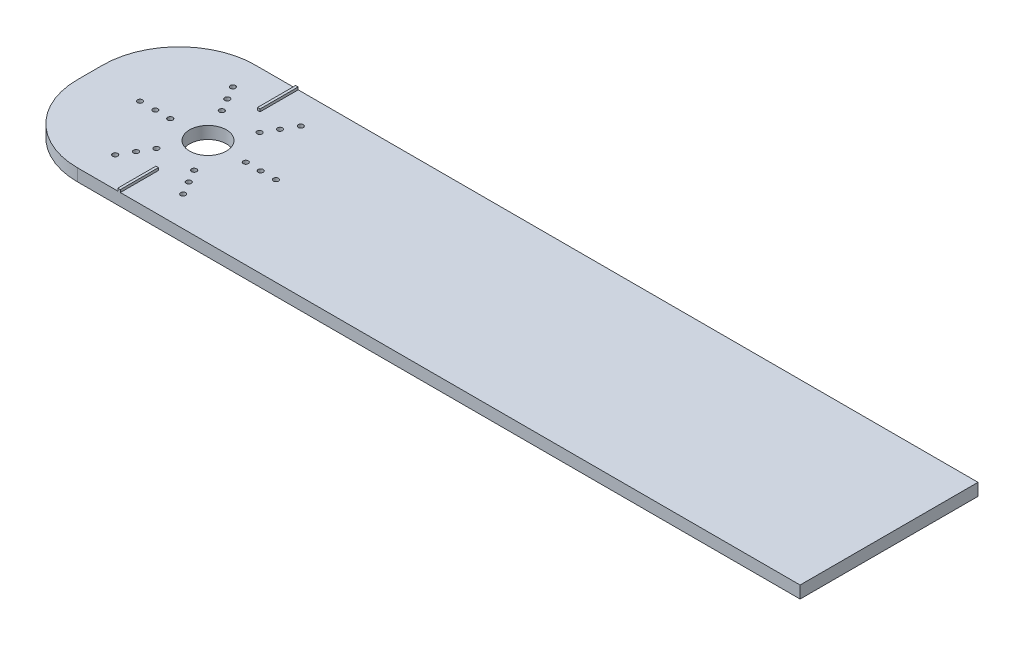
ISO-10303-21;
HEADER;
FILE_DESCRIPTION(('STEP AP214'),'2;1');
FILE_NAME('part.step','',(''),(''),'','','');
FILE_SCHEMA(('AUTOMOTIVE_DESIGN { 1 0 10303 214 1 1 1 1 }'));
ENDSEC;
DATA;
#1=APPLICATION_CONTEXT('core data for automotive mechanical design processes');
#2=APPLICATION_PROTOCOL_DEFINITION('international standard','automotive_design',2000,#1);
#3=PRODUCT_CONTEXT('',#1,'mechanical');
#4=PRODUCT('Part','Part','',(#3));
#5=PRODUCT_RELATED_PRODUCT_CATEGORY('part','',(#4));
#6=PRODUCT_DEFINITION_FORMATION('','',#4);
#7=PRODUCT_DEFINITION_CONTEXT('part definition',#1,'design');
#8=PRODUCT_DEFINITION('design','',#6,#7);
#9=PRODUCT_DEFINITION_SHAPE('','',#8);
#10=(LENGTH_UNIT() NAMED_UNIT(*) SI_UNIT(.MILLI.,.METRE.));
#11=(NAMED_UNIT(*) PLANE_ANGLE_UNIT() SI_UNIT($,.RADIAN.));
#12=(NAMED_UNIT(*) SI_UNIT($,.STERADIAN.) SOLID_ANGLE_UNIT());
#13=UNCERTAINTY_MEASURE_WITH_UNIT(LENGTH_MEASURE(1.E-05),#10,'distance_accuracy_value','');
#14=(GEOMETRIC_REPRESENTATION_CONTEXT(3) GLOBAL_UNCERTAINTY_ASSIGNED_CONTEXT((#13)) GLOBAL_UNIT_ASSIGNED_CONTEXT((#10,
#11,#12)) REPRESENTATION_CONTEXT('',''));
#15=CARTESIAN_POINT('',(0.,0.,0.));
#16=DIRECTION('',(0.,0.,1.));
#17=DIRECTION('',(1.,0.,0.));
#18=AXIS2_PLACEMENT_3D('',#15,#16,#17);
#19=CARTESIAN_POINT('',(0.,2.4,0.));
#20=DIRECTION('',(0.,1.,0.));
#21=DIRECTION('',(0.,0.,1.));
#22=AXIS2_PLACEMENT_3D('',#19,#20,#21);
#23=PLANE('',#22);
#24=CARTESIAN_POINT('',(-2.76205382436268,2.4,-15.0611819580969));
#25=DIRECTION('',(0.,1.,0.));
#26=DIRECTION('',(0.,0.,1.));
#27=AXIS2_PLACEMENT_3D('',#24,#25,#26);
#28=CIRCLE('',#27,0.499999999999997);
#29=CARTESIAN_POINT('',(-2.76205382436268,2.4,-14.5611819580969));
#30=VERTEX_POINT('',#29);
#31=EDGE_CURVE('E202',#30,#30,#28,.T.);
#32=ORIENTED_EDGE('',*,*,#31,.F.);
#33=EDGE_LOOP('',(#32));
#34=FACE_BOUND('',#33,.T.);
#35=CARTESIAN_POINT('',(6.89294617563739,2.4,-21.4957507082152));
#36=DIRECTION('',(0.,1.,0.));
#37=DIRECTION('',(0.,0.,1.));
#38=AXIS2_PLACEMENT_3D('',#35,#36,#37);
#39=CIRCLE('',#38,0.500000000000001);
#40=CARTESIAN_POINT('',(6.89294617563739,2.4,-20.9957507082152));
#41=VERTEX_POINT('',#40);
#42=EDGE_CURVE('E233',#41,#41,#39,.T.);
#43=ORIENTED_EDGE('',*,*,#42,.F.);
#44=EDGE_LOOP('',(#43));
#45=FACE_BOUND('',#44,.T.);
#46=CARTESIAN_POINT('',(3.88794617563739,2.4,-21.4957507082152));
#47=DIRECTION('',(0.,1.,0.));
#48=DIRECTION('',(0.,0.,1.));
#49=AXIS2_PLACEMENT_3D('',#46,#47,#48);
#50=CIRCLE('',#49,0.500000000000001);
#51=CARTESIAN_POINT('',(3.88794617563739,2.4,-20.9957507082152));
#52=VERTEX_POINT('',#51);
#53=EDGE_CURVE('E232',#52,#52,#50,.T.);
#54=ORIENTED_EDGE('',*,*,#53,.F.);
#55=EDGE_LOOP('',(#54));
#56=FACE_BOUND('',#55,.T.);
#57=CARTESIAN_POINT('',(0.952946175637384,2.4,-21.4957507082152));
#58=DIRECTION('',(0.,1.,0.));
#59=DIRECTION('',(0.,0.,1.));
#60=AXIS2_PLACEMENT_3D('',#57,#58,#59);
#61=CIRCLE('',#60,0.499999999999998);
#62=CARTESIAN_POINT('',(0.952946175637384,2.4,-20.9957507082152));
#63=VERTEX_POINT('',#62);
#64=EDGE_CURVE('E245',#63,#63,#61,.T.);
#65=ORIENTED_EDGE('',*,*,#64,.F.);
#66=EDGE_LOOP('',(#65));
#67=FACE_BOUND('',#66,.T.);
#68=CARTESIAN_POINT('',(-1.2945538243627,2.4,-12.5193973979895));
#69=DIRECTION('',(0.,1.,0.));
#70=DIRECTION('',(0.,0.,1.));
#71=AXIS2_PLACEMENT_3D('',#68,#69,#70);
#72=CIRCLE('',#71,0.499999999999999);
#73=CARTESIAN_POINT('',(-1.2945538243627,2.4,-12.0193973979895));
#74=VERTEX_POINT('',#73);
#75=EDGE_CURVE('E203',#74,#74,#72,.T.);
#76=ORIENTED_EDGE('',*,*,#75,.F.);
#77=EDGE_LOOP('',(#76));
#78=FACE_BOUND('',#77,.T.);
#79=CARTESIAN_POINT('',(0.207946175637278,2.4,-9.91699105961728));
#80=DIRECTION('',(0.,1.,0.));
#81=DIRECTION('',(0.,0.,1.));
#82=AXIS2_PLACEMENT_3D('',#79,#80,#81);
#83=CIRCLE('',#82,0.499999999999997);
#84=CARTESIAN_POINT('',(0.207946175637278,2.4,-9.41699105961729));
#85=VERTEX_POINT('',#84);
#86=EDGE_CURVE('E209',#85,#85,#83,.T.);
#87=ORIENTED_EDGE('',*,*,#86,.F.);
#88=EDGE_LOOP('',(#87));
#89=FACE_BOUND('',#88,.T.);
#90=CARTESIAN_POINT('',(-10.1920538243627,2.4,-15.061181958097));
#91=DIRECTION('',(0.,1.,0.));
#92=DIRECTION('',(0.,0.,1.));
#93=AXIS2_PLACEMENT_3D('',#90,#91,#92);
#94=CIRCLE('',#93,0.5);
#95=CARTESIAN_POINT('',(-10.1920538243627,2.4,-14.561181958097));
#96=VERTEX_POINT('',#95);
#97=EDGE_CURVE('E215',#96,#96,#94,.T.);
#98=ORIENTED_EDGE('',*,*,#97,.F.);
#99=EDGE_LOOP('',(#98));
#100=FACE_BOUND('',#99,.T.);
#101=CARTESIAN_POINT('',(-11.6595538243627,2.4,-12.5193973979896));
#102=DIRECTION('',(0.,1.,0.));
#103=DIRECTION('',(0.,0.,1.));
#104=AXIS2_PLACEMENT_3D('',#101,#102,#103);
#105=CIRCLE('',#104,0.5);
#106=CARTESIAN_POINT('',(-11.6595538243627,2.4,-12.0193973979896));
#107=VERTEX_POINT('',#106);
#108=EDGE_CURVE('E221',#107,#107,#105,.T.);
#109=ORIENTED_EDGE('',*,*,#108,.F.);
#110=EDGE_LOOP('',(#109));
#111=FACE_BOUND('',#110,.T.);
#112=CARTESIAN_POINT('',(-13.1620538243628,2.4,-9.91699105961742));
#113=DIRECTION('',(0.,1.,0.));
#114=DIRECTION('',(0.,0.,1.));
#115=AXIS2_PLACEMENT_3D('',#112,#113,#114);
#116=CIRCLE('',#115,0.5);
#117=CARTESIAN_POINT('',(-13.1620538243628,2.4,-9.41699105961742));
#118=VERTEX_POINT('',#117);
#119=EDGE_CURVE('E198',#118,#118,#116,.T.);
#120=ORIENTED_EDGE('',*,*,#119,.F.);
#121=EDGE_LOOP('',(#120));
#122=FACE_BOUND('',#121,.T.);
#123=CARTESIAN_POINT('',(-10.1920538243626,2.4,-27.9303194583337));
#124=DIRECTION('',(0.,1.,0.));
#125=DIRECTION('',(0.,0.,1.));
#126=AXIS2_PLACEMENT_3D('',#123,#124,#125);
#127=CIRCLE('',#126,0.499999999999998);
#128=CARTESIAN_POINT('',(-10.1920538243626,2.4,-27.4303194583337));
#129=VERTEX_POINT('',#128);
#130=EDGE_CURVE('E256',#129,#129,#127,.T.);
#131=ORIENTED_EDGE('',*,*,#130,.F.);
#132=EDGE_LOOP('',(#131));
#133=FACE_BOUND('',#132,.T.);
#134=CARTESIAN_POINT('',(-19.8470538243626,2.4,-21.4957507082153));
#135=DIRECTION('',(0.,1.,0.));
#136=DIRECTION('',(0.,0.,1.));
#137=AXIS2_PLACEMENT_3D('',#134,#135,#136);
#138=CIRCLE('',#137,0.499999999999999);
#139=CARTESIAN_POINT('',(-19.8470538243626,2.4,-20.9957507082153));
#140=VERTEX_POINT('',#139);
#141=EDGE_CURVE('E287',#140,#140,#138,.T.);
#142=ORIENTED_EDGE('',*,*,#141,.F.);
#143=EDGE_LOOP('',(#142));
#144=FACE_BOUND('',#143,.T.);
#145=CARTESIAN_POINT('',(-16.8420538243626,2.4,-21.4957507082153));
#146=DIRECTION('',(0.,1.,0.));
#147=DIRECTION('',(0.,0.,1.));
#148=AXIS2_PLACEMENT_3D('',#145,#146,#147);
#149=CIRCLE('',#148,0.499999999999999);
#150=CARTESIAN_POINT('',(-16.8420538243626,2.4,-20.9957507082153));
#151=VERTEX_POINT('',#150);
#152=EDGE_CURVE('E286',#151,#151,#149,.T.);
#153=ORIENTED_EDGE('',*,*,#152,.F.);
#154=EDGE_LOOP('',(#153));
#155=FACE_BOUND('',#154,.T.);
#156=CARTESIAN_POINT('',(-13.9070538243626,2.4,-21.4957507082153));
#157=DIRECTION('',(0.,1.,0.));
#158=DIRECTION('',(0.,0.,1.));
#159=AXIS2_PLACEMENT_3D('',#156,#157,#158);
#160=CIRCLE('',#159,0.499999999999999);
#161=CARTESIAN_POINT('',(-13.9070538243626,2.4,-20.9957507082153));
#162=VERTEX_POINT('',#161);
#163=EDGE_CURVE('E299',#162,#162,#160,.T.);
#164=ORIENTED_EDGE('',*,*,#163,.F.);
#165=EDGE_LOOP('',(#164));
#166=FACE_BOUND('',#165,.T.);
#167=CARTESIAN_POINT('',(-11.6595538243626,2.4,-30.472104018441));
#168=DIRECTION('',(0.,1.,0.));
#169=DIRECTION('',(0.,0.,1.));
#170=AXIS2_PLACEMENT_3D('',#167,#168,#169);
#171=CIRCLE('',#170,0.499999999999999);
#172=CARTESIAN_POINT('',(-11.6595538243626,2.4,-29.972104018441));
#173=VERTEX_POINT('',#172);
#174=EDGE_CURVE('E257',#173,#173,#171,.T.);
#175=ORIENTED_EDGE('',*,*,#174,.F.);
#176=EDGE_LOOP('',(#175));
#177=FACE_BOUND('',#176,.T.);
#178=CARTESIAN_POINT('',(-13.1620538243626,2.4,-33.0745103568132));
#179=DIRECTION('',(0.,1.,0.));
#180=DIRECTION('',(0.,0.,1.));
#181=AXIS2_PLACEMENT_3D('',#178,#179,#180);
#182=CIRCLE('',#181,0.499999999999998);
#183=CARTESIAN_POINT('',(-13.1620538243626,2.4,-32.5745103568132));
#184=VERTEX_POINT('',#183);
#185=EDGE_CURVE('E263',#184,#184,#182,.T.);
#186=ORIENTED_EDGE('',*,*,#185,.F.);
#187=EDGE_LOOP('',(#186));
#188=FACE_BOUND('',#187,.T.);
#189=CARTESIAN_POINT('',(-2.76205382436258,2.4,-27.9303194583336));
#190=DIRECTION('',(0.,1.,0.));
#191=DIRECTION('',(0.,0.,1.));
#192=AXIS2_PLACEMENT_3D('',#189,#190,#191);
#193=CIRCLE('',#192,0.500000000000001);
#194=CARTESIAN_POINT('',(-2.76205382436258,2.4,-27.4303194583336));
#195=VERTEX_POINT('',#194);
#196=EDGE_CURVE('E269',#195,#195,#193,.T.);
#197=ORIENTED_EDGE('',*,*,#196,.F.);
#198=EDGE_LOOP('',(#197));
#199=FACE_BOUND('',#198,.T.);
#200=CARTESIAN_POINT('',(-1.29455382436257,2.4,-30.472104018441));
#201=DIRECTION('',(0.,1.,0.));
#202=DIRECTION('',(0.,0.,1.));
#203=AXIS2_PLACEMENT_3D('',#200,#201,#202);
#204=CIRCLE('',#203,0.5);
#205=CARTESIAN_POINT('',(-1.29455382436257,2.4,-29.972104018441));
#206=VERTEX_POINT('',#205);
#207=EDGE_CURVE('E275',#206,#206,#204,.T.);
#208=ORIENTED_EDGE('',*,*,#207,.F.);
#209=EDGE_LOOP('',(#208));
#210=FACE_BOUND('',#209,.T.);
#211=CARTESIAN_POINT('',(0.207946175637443,2.4,-33.0745103568132));
#212=DIRECTION('',(0.,1.,0.));
#213=DIRECTION('',(0.,0.,1.));
#214=AXIS2_PLACEMENT_3D('',#211,#212,#213);
#215=CIRCLE('',#214,0.5);
#216=CARTESIAN_POINT('',(0.207946175637443,2.4,-32.5745103568132));
#217=VERTEX_POINT('',#216);
#218=EDGE_CURVE('E244',#217,#217,#215,.T.);
#219=ORIENTED_EDGE('',*,*,#218,.F.);
#220=EDGE_LOOP('',(#219));
#221=FACE_BOUND('',#220,.T.);
#222=CARTESIAN_POINT('',(-6.47705382436261,2.4,-21.4957507082153));
#223=DIRECTION('',(0.,1.,0.));
#224=DIRECTION('',(0.,0.,1.));
#225=AXIS2_PLACEMENT_3D('',#222,#223,#224);
#226=CIRCLE('',#225,3.625);
#227=CARTESIAN_POINT('',(-6.47705382436261,2.4,-17.8707507082153));
#228=VERTEX_POINT('',#227);
#229=EDGE_CURVE('E298',#228,#228,#226,.T.);
#230=ORIENTED_EDGE('',*,*,#229,.F.);
#231=EDGE_LOOP('',(#230));
#232=FACE_BOUND('',#231,.T.);
#233=DIRECTION('',(0.,0.,1.));
#234=VECTOR('',#233,1.);
#235=CARTESIAN_POINT('',(-29.6770538243626,2.4,-38.9957507082153));
#236=LINE('',#235,#234);
#237=CARTESIAN_POINT('',(-29.6770538243626,2.4,-23.9957507082153));
#238=VERTEX_POINT('',#237);
#239=CARTESIAN_POINT('',(-29.6770538243626,2.4,-18.9957507082153));
#240=VERTEX_POINT('',#239);
#241=EDGE_CURVE('E313',#238,#240,#236,.T.);
#242=ORIENTED_EDGE('',*,*,#241,.T.);
#243=CARTESIAN_POINT('',(-14.6770538243626,2.4,-18.9957507082153));
#244=DIRECTION('',(0.,1.,0.));
#245=DIRECTION('',(0.,0.,1.));
#246=AXIS2_PLACEMENT_3D('',#243,#244,#245);
#247=CIRCLE('',#246,15.);
#248=CARTESIAN_POINT('',(-14.6770538243626,2.4,-3.99575070821528));
#249=VERTEX_POINT('',#248);
#250=EDGE_CURVE('E42',#240,#249,#247,.T.);
#251=ORIENTED_EDGE('',*,*,#250,.T.);
#252=DIRECTION('',(1.,0.,0.));
#253=VECTOR('',#252,1.);
#254=CARTESIAN_POINT('',(-29.6770538243626,2.4,-3.99575070821528));
#255=LINE('',#254,#253);
#256=CARTESIAN_POINT('',(-6.72705382436262,2.4,-3.99575070821528));
#257=VERTEX_POINT('',#256);
#258=EDGE_CURVE('E316',#249,#257,#255,.T.);
#259=ORIENTED_EDGE('',*,*,#258,.T.);
#260=DIRECTION('',(0.,0.,1.));
#261=VECTOR('',#260,1.);
#262=CARTESIAN_POINT('',(-6.72705382436262,2.4,-3.99575070821528));
#263=LINE('',#262,#261);
#264=CARTESIAN_POINT('',(-6.72705382436261,2.4,-11.4957507082153));
#265=VERTEX_POINT('',#264);
#266=EDGE_CURVE('E156',#265,#257,#263,.T.);
#267=ORIENTED_EDGE('',*,*,#266,.F.);
#268=DIRECTION('',(-1.,0.,0.));
#269=VECTOR('',#268,1.);
#270=CARTESIAN_POINT('',(-6.72705382436261,2.4,-11.4957507082153));
#271=LINE('',#270,#269);
#272=CARTESIAN_POINT('',(-6.22705382436262,2.4,-11.4957507082153));
#273=VERTEX_POINT('',#272);
#274=EDGE_CURVE('E374',#273,#265,#271,.T.);
#275=ORIENTED_EDGE('',*,*,#274,.F.);
#276=DIRECTION('',(0.,0.,-1.));
#277=VECTOR('',#276,1.);
#278=CARTESIAN_POINT('',(-6.22705382436262,2.4,-3.99575070821528));
#279=LINE('',#278,#277);
#280=CARTESIAN_POINT('',(-6.22705382436262,2.4,-3.99575070821528));
#281=VERTEX_POINT('',#280);
#282=EDGE_CURVE('E372',#281,#273,#279,.T.);
#283=ORIENTED_EDGE('',*,*,#282,.F.);
#284=CARTESIAN_POINT('',(127.522946175637,2.4,-3.99575070821528));
#285=VERTEX_POINT('',#284);
#286=EDGE_CURVE('E162',#281,#285,#255,.T.);
#287=ORIENTED_EDGE('',*,*,#286,.T.);
#288=DIRECTION('',(0.,0.,-1.));
#289=VECTOR('',#288,1.);
#290=CARTESIAN_POINT('',(127.522946175637,2.4,-38.9957507082153));
#291=LINE('',#290,#289);
#292=CARTESIAN_POINT('',(127.522946175637,2.4,-38.9957507082153));
#293=VERTEX_POINT('',#292);
#294=EDGE_CURVE('E318',#285,#293,#291,.T.);
#295=ORIENTED_EDGE('',*,*,#294,.T.);
#296=DIRECTION('',(-1.,0.,0.));
#297=VECTOR('',#296,1.);
#298=CARTESIAN_POINT('',(-29.6770538243626,2.4,-38.9957507082153));
#299=LINE('',#298,#297);
#300=CARTESIAN_POINT('',(-6.22705382436262,2.4,-38.9957507082153));
#301=VERTEX_POINT('',#300);
#302=EDGE_CURVE('E321',#293,#301,#299,.T.);
#303=ORIENTED_EDGE('',*,*,#302,.T.);
#304=DIRECTION('',(0.,0.,-1.));
#305=VECTOR('',#304,1.);
#306=CARTESIAN_POINT('',(-6.22705382436262,2.4,-38.9957507082153));
#307=LINE('',#306,#305);
#308=CARTESIAN_POINT('',(-6.22705382436262,2.4,-31.4957507082153));
#309=VERTEX_POINT('',#308);
#310=EDGE_CURVE('E176',#309,#301,#307,.T.);
#311=ORIENTED_EDGE('',*,*,#310,.F.);
#312=DIRECTION('',(1.,0.,0.));
#313=VECTOR('',#312,1.);
#314=CARTESIAN_POINT('',(-6.72705382436261,2.4,-31.4957507082153));
#315=LINE('',#314,#313);
#316=CARTESIAN_POINT('',(-6.72705382436261,2.4,-31.4957507082153));
#317=VERTEX_POINT('',#316);
#318=EDGE_CURVE('E166',#317,#309,#315,.T.);
#319=ORIENTED_EDGE('',*,*,#318,.F.);
#320=DIRECTION('',(0.,0.,1.));
#321=VECTOR('',#320,1.);
#322=CARTESIAN_POINT('',(-6.72705382436262,2.4,-38.9957507082153));
#323=LINE('',#322,#321);
#324=CARTESIAN_POINT('',(-6.72705382436262,2.4,-38.9957507082153));
#325=VERTEX_POINT('',#324);
#326=EDGE_CURVE('E163',#325,#317,#323,.T.);
#327=ORIENTED_EDGE('',*,*,#326,.F.);
#328=CARTESIAN_POINT('',(-14.6770538243626,2.4,-38.9957507082153));
#329=VERTEX_POINT('',#328);
#330=EDGE_CURVE('E320',#325,#329,#299,.T.);
#331=ORIENTED_EDGE('',*,*,#330,.T.);
#332=CARTESIAN_POINT('',(-14.6770538243626,2.4,-23.9957507082153));
#333=DIRECTION('',(0.,1.,0.));
#334=DIRECTION('',(0.,0.,1.));
#335=AXIS2_PLACEMENT_3D('',#332,#333,#334);
#336=CIRCLE('',#335,15.);
#337=EDGE_CURVE('E346',#329,#238,#336,.T.);
#338=ORIENTED_EDGE('',*,*,#337,.T.);
#339=EDGE_LOOP('',(#242,#251,#259,#267,#275,#283,#287,#295,#303,#311,#319,#327,#331,#338));
#340=FACE_BOUND('',#339,.T.);
#341=ADVANCED_FACE('F34',(#34,#45,#56,#67,#78,#89,#100,#111,#122,#133,#144,#155,#166,#177,#188,
#199,#210,#221,#232,#340),#23,.T.);
#342=CARTESIAN_POINT('',(-29.6770538243626,2.4,-38.9957507082153));
#343=DIRECTION('',(1.,0.,0.));
#344=DIRECTION('',(0.,0.,-1.));
#345=AXIS2_PLACEMENT_3D('',#342,#343,#344);
#346=PLANE('',#345);
#347=DIRECTION('',(0.,0.,1.));
#348=VECTOR('',#347,1.);
#349=CARTESIAN_POINT('',(-29.6770538243626,0.,-38.9957507082153));
#350=LINE('',#349,#348);
#351=CARTESIAN_POINT('',(-29.6770538243626,0.,-23.9957507082153));
#352=VERTEX_POINT('',#351);
#353=CARTESIAN_POINT('',(-29.6770538243626,0.,-18.9957507082153));
#354=VERTEX_POINT('',#353);
#355=EDGE_CURVE('E310',#352,#354,#350,.T.);
#356=ORIENTED_EDGE('',*,*,#355,.T.);
#357=DIRECTION('',(0.,-1.,0.));
#358=VECTOR('',#357,1.);
#359=CARTESIAN_POINT('',(-29.6770538243626,2.4,-18.9957507082153));
#360=LINE('',#359,#358);
#361=EDGE_CURVE('E55',#354,#240,#360,.F.);
#362=ORIENTED_EDGE('',*,*,#361,.T.);
#363=ORIENTED_EDGE('',*,*,#241,.F.);
#364=DIRECTION('',(0.,-1.,0.));
#365=VECTOR('',#364,1.);
#366=CARTESIAN_POINT('',(-29.6770538243626,2.4,-23.9957507082153));
#367=LINE('',#366,#365);
#368=EDGE_CURVE('E342',#238,#352,#367,.T.);
#369=ORIENTED_EDGE('',*,*,#368,.T.);
#370=EDGE_LOOP('',(#356,#362,#363,#369));
#371=FACE_BOUND('',#370,.T.);
#372=ADVANCED_FACE('F360',(#371),#346,.F.);
#373=CARTESIAN_POINT('',(-29.6770538243626,2.4,-3.99575070821528));
#374=DIRECTION('',(0.,0.,-1.));
#375=DIRECTION('',(-1.,0.,0.));
#376=AXIS2_PLACEMENT_3D('',#373,#374,#375);
#377=PLANE('',#376);
#378=ORIENTED_EDGE('',*,*,#258,.F.);
#379=DIRECTION('',(0.,-1.,0.));
#380=VECTOR('',#379,1.);
#381=CARTESIAN_POINT('',(-14.6770538243626,2.4,-3.99575070821528));
#382=LINE('',#381,#380);
#383=CARTESIAN_POINT('',(-14.6770538243626,0.,-3.99575070821528));
#384=VERTEX_POINT('',#383);
#385=EDGE_CURVE('E335',#249,#384,#382,.T.);
#386=ORIENTED_EDGE('',*,*,#385,.T.);
#387=DIRECTION('',(1.,0.,0.));
#388=VECTOR('',#387,1.);
#389=CARTESIAN_POINT('',(-29.6770538243626,0.,-3.99575070821528));
#390=LINE('',#389,#388);
#391=CARTESIAN_POINT('',(127.522946175637,0.,-3.99575070821528));
#392=VERTEX_POINT('',#391);
#393=EDGE_CURVE('E325',#384,#392,#390,.T.);
#394=ORIENTED_EDGE('',*,*,#393,.T.);
#395=DIRECTION('',(0.,-1.,0.));
#396=VECTOR('',#395,1.);
#397=CARTESIAN_POINT('',(127.522946175637,2.4,-3.99575070821528));
#398=LINE('',#397,#396);
#399=EDGE_CURVE('E332',#285,#392,#398,.T.);
#400=ORIENTED_EDGE('',*,*,#399,.F.);
#401=ORIENTED_EDGE('',*,*,#286,.F.);
#402=DIRECTION('',(0.,-1.,0.));
#403=VECTOR('',#402,1.);
#404=CARTESIAN_POINT('',(-6.22705382436262,2.9,-3.99575070821528));
#405=LINE('',#404,#403);
#406=CARTESIAN_POINT('',(-6.22705382436262,2.9,-3.99575070821528));
#407=VERTEX_POINT('',#406);
#408=EDGE_CURVE('E140',#407,#281,#405,.T.);
#409=ORIENTED_EDGE('',*,*,#408,.F.);
#410=DIRECTION('',(1.,0.,0.));
#411=VECTOR('',#410,1.);
#412=CARTESIAN_POINT('',(-6.72705382436262,2.9,-3.99575070821528));
#413=LINE('',#412,#411);
#414=CARTESIAN_POINT('',(-6.72705382436262,2.9,-3.99575070821528));
#415=VERTEX_POINT('',#414);
#416=EDGE_CURVE('E147',#415,#407,#413,.T.);
#417=ORIENTED_EDGE('',*,*,#416,.F.);
#418=DIRECTION('',(0.,-1.,0.));
#419=VECTOR('',#418,1.);
#420=CARTESIAN_POINT('',(-6.72705382436262,2.9,-3.99575070821528));
#421=LINE('',#420,#419);
#422=EDGE_CURVE('E354',#415,#257,#421,.T.);
#423=ORIENTED_EDGE('',*,*,#422,.T.);
#424=EDGE_LOOP('',(#378,#386,#394,#400,#401,#409,#417,#423));
#425=FACE_BOUND('',#424,.T.);
#426=ADVANCED_FACE('F160',(#425),#377,.F.);
#427=CARTESIAN_POINT('',(127.522946175637,2.4,-38.9957507082153));
#428=DIRECTION('',(-1.,0.,0.));
#429=DIRECTION('',(0.,0.,1.));
#430=AXIS2_PLACEMENT_3D('',#427,#428,#429);
#431=PLANE('',#430);
#432=DIRECTION('',(0.,0.,-1.));
#433=VECTOR('',#432,1.);
#434=CARTESIAN_POINT('',(127.522946175637,0.,-38.9957507082153));
#435=LINE('',#434,#433);
#436=CARTESIAN_POINT('',(127.522946175637,0.,-38.9957507082153));
#437=VERTEX_POINT('',#436);
#438=EDGE_CURVE('E327',#392,#437,#435,.T.);
#439=ORIENTED_EDGE('',*,*,#438,.T.);
#440=DIRECTION('',(0.,-1.,0.));
#441=VECTOR('',#440,1.);
#442=CARTESIAN_POINT('',(127.522946175637,2.4,-38.9957507082153));
#443=LINE('',#442,#441);
#444=EDGE_CURVE('E323',#293,#437,#443,.T.);
#445=ORIENTED_EDGE('',*,*,#444,.F.);
#446=ORIENTED_EDGE('',*,*,#294,.F.);
#447=ORIENTED_EDGE('',*,*,#399,.T.);
#448=EDGE_LOOP('',(#439,#445,#446,#447));
#449=FACE_BOUND('',#448,.T.);
#450=ADVANCED_FACE('F370',(#449),#431,.F.);
#451=CARTESIAN_POINT('',(-29.6770538243626,2.4,-38.9957507082153));
#452=DIRECTION('',(0.,0.,1.));
#453=DIRECTION('',(1.,0.,0.));
#454=AXIS2_PLACEMENT_3D('',#451,#452,#453);
#455=PLANE('',#454);
#456=DIRECTION('',(-1.,0.,0.));
#457=VECTOR('',#456,1.);
#458=CARTESIAN_POINT('',(-29.6770538243626,0.,-38.9957507082153));
#459=LINE('',#458,#457);
#460=CARTESIAN_POINT('',(-14.6770538243626,0.,-38.9957507082153));
#461=VERTEX_POINT('',#460);
#462=EDGE_CURVE('E315',#437,#461,#459,.T.);
#463=ORIENTED_EDGE('',*,*,#462,.T.);
#464=DIRECTION('',(0.,-1.,0.));
#465=VECTOR('',#464,1.);
#466=CARTESIAN_POINT('',(-14.6770538243626,2.4,-38.9957507082153));
#467=LINE('',#466,#465);
#468=EDGE_CURVE('E11',#461,#329,#467,.F.);
#469=ORIENTED_EDGE('',*,*,#468,.T.);
#470=ORIENTED_EDGE('',*,*,#330,.F.);
#471=DIRECTION('',(0.,-1.,0.));
#472=VECTOR('',#471,1.);
#473=CARTESIAN_POINT('',(-6.72705382436262,2.9,-38.9957507082153));
#474=LINE('',#473,#472);
#475=CARTESIAN_POINT('',(-6.72705382436262,2.9,-38.9957507082153));
#476=VERTEX_POINT('',#475);
#477=EDGE_CURVE('E181',#476,#325,#474,.T.);
#478=ORIENTED_EDGE('',*,*,#477,.F.);
#479=DIRECTION('',(-1.,0.,0.));
#480=VECTOR('',#479,1.);
#481=CARTESIAN_POINT('',(-6.72705382436262,2.9,-38.9957507082153));
#482=LINE('',#481,#480);
#483=CARTESIAN_POINT('',(-6.22705382436262,2.9,-38.9957507082153));
#484=VERTEX_POINT('',#483);
#485=EDGE_CURVE('E180',#484,#476,#482,.T.);
#486=ORIENTED_EDGE('',*,*,#485,.F.);
#487=DIRECTION('',(0.,-1.,0.));
#488=VECTOR('',#487,1.);
#489=CARTESIAN_POINT('',(-6.22705382436262,2.9,-38.9957507082153));
#490=LINE('',#489,#488);
#491=EDGE_CURVE('E189',#484,#301,#490,.T.);
#492=ORIENTED_EDGE('',*,*,#491,.T.);
#493=ORIENTED_EDGE('',*,*,#302,.F.);
#494=ORIENTED_EDGE('',*,*,#444,.T.);
#495=EDGE_LOOP('',(#463,#469,#470,#478,#486,#492,#493,#494));
#496=FACE_BOUND('',#495,.T.);
#497=ADVANCED_FACE('F365',(#496),#455,.F.);
#498=CARTESIAN_POINT('',(0.,0.,0.));
#499=DIRECTION('',(0.,1.,0.));
#500=DIRECTION('',(0.,0.,1.));
#501=AXIS2_PLACEMENT_3D('',#498,#499,#500);
#502=PLANE('',#501);
#503=CARTESIAN_POINT('',(-2.76205382436268,0.,-15.0611819580969));
#504=DIRECTION('',(0.,1.,0.));
#505=DIRECTION('',(0.,0.,1.));
#506=AXIS2_PLACEMENT_3D('',#503,#504,#505);
#507=CIRCLE('',#506,0.499999999999997);
#508=CARTESIAN_POINT('',(-2.76205382436268,0.,-14.5611819580969));
#509=VERTEX_POINT('',#508);
#510=EDGE_CURVE('E236',#509,#509,#507,.T.);
#511=ORIENTED_EDGE('',*,*,#510,.T.);
#512=EDGE_LOOP('',(#511));
#513=FACE_BOUND('',#512,.T.);
#514=CARTESIAN_POINT('',(6.89294617563739,0.,-21.4957507082152));
#515=DIRECTION('',(0.,1.,0.));
#516=DIRECTION('',(0.,0.,1.));
#517=AXIS2_PLACEMENT_3D('',#514,#515,#516);
#518=CIRCLE('',#517,0.500000000000001);
#519=CARTESIAN_POINT('',(6.89294617563739,0.,-20.9957507082152));
#520=VERTEX_POINT('',#519);
#521=EDGE_CURVE('E229',#520,#520,#518,.T.);
#522=ORIENTED_EDGE('',*,*,#521,.T.);
#523=EDGE_LOOP('',(#522));
#524=FACE_BOUND('',#523,.T.);
#525=CARTESIAN_POINT('',(3.88794617563739,0.,-21.4957507082152));
#526=DIRECTION('',(0.,1.,0.));
#527=DIRECTION('',(0.,0.,1.));
#528=AXIS2_PLACEMENT_3D('',#525,#526,#527);
#529=CIRCLE('',#528,0.500000000000001);
#530=CARTESIAN_POINT('',(3.88794617563739,0.,-20.9957507082152));
#531=VERTEX_POINT('',#530);
#532=EDGE_CURVE('E248',#531,#531,#529,.T.);
#533=ORIENTED_EDGE('',*,*,#532,.T.);
#534=EDGE_LOOP('',(#533));
#535=FACE_BOUND('',#534,.T.);
#536=CARTESIAN_POINT('',(0.952946175637384,0.,-21.4957507082152));
#537=DIRECTION('',(0.,1.,0.));
#538=DIRECTION('',(0.,0.,1.));
#539=AXIS2_PLACEMENT_3D('',#536,#537,#538);
#540=CIRCLE('',#539,0.499999999999998);
#541=CARTESIAN_POINT('',(0.952946175637384,0.,-20.9957507082152));
#542=VERTEX_POINT('',#541);
#543=EDGE_CURVE('E241',#542,#542,#540,.T.);
#544=ORIENTED_EDGE('',*,*,#543,.T.);
#545=EDGE_LOOP('',(#544));
#546=FACE_BOUND('',#545,.T.);
#547=CARTESIAN_POINT('',(-1.2945538243627,0.,-12.5193973979895));
#548=DIRECTION('',(0.,1.,0.));
#549=DIRECTION('',(0.,0.,1.));
#550=AXIS2_PLACEMENT_3D('',#547,#548,#549);
#551=CIRCLE('',#550,0.499999999999999);
#552=CARTESIAN_POINT('',(-1.2945538243627,0.,-12.0193973979895));
#553=VERTEX_POINT('',#552);
#554=EDGE_CURVE('E199',#553,#553,#551,.T.);
#555=ORIENTED_EDGE('',*,*,#554,.T.);
#556=EDGE_LOOP('',(#555));
#557=FACE_BOUND('',#556,.T.);
#558=CARTESIAN_POINT('',(0.207946175637278,0.,-9.91699105961728));
#559=DIRECTION('',(0.,1.,0.));
#560=DIRECTION('',(0.,0.,1.));
#561=AXIS2_PLACEMENT_3D('',#558,#559,#560);
#562=CIRCLE('',#561,0.499999999999997);
#563=CARTESIAN_POINT('',(0.207946175637278,0.,-9.41699105961729));
#564=VERTEX_POINT('',#563);
#565=EDGE_CURVE('E206',#564,#564,#562,.T.);
#566=ORIENTED_EDGE('',*,*,#565,.T.);
#567=EDGE_LOOP('',(#566));
#568=FACE_BOUND('',#567,.T.);
#569=CARTESIAN_POINT('',(-10.1920538243627,0.,-15.061181958097));
#570=DIRECTION('',(0.,1.,0.));
#571=DIRECTION('',(0.,0.,1.));
#572=AXIS2_PLACEMENT_3D('',#569,#570,#571);
#573=CIRCLE('',#572,0.5);
#574=CARTESIAN_POINT('',(-10.1920538243627,0.,-14.561181958097));
#575=VERTEX_POINT('',#574);
#576=EDGE_CURVE('E212',#575,#575,#573,.T.);
#577=ORIENTED_EDGE('',*,*,#576,.T.);
#578=EDGE_LOOP('',(#577));
#579=FACE_BOUND('',#578,.T.);
#580=CARTESIAN_POINT('',(-11.6595538243627,0.,-12.5193973979896));
#581=DIRECTION('',(0.,1.,0.));
#582=DIRECTION('',(0.,0.,1.));
#583=AXIS2_PLACEMENT_3D('',#580,#581,#582);
#584=CIRCLE('',#583,0.5);
#585=CARTESIAN_POINT('',(-11.6595538243627,0.,-12.0193973979896));
#586=VERTEX_POINT('',#585);
#587=EDGE_CURVE('E218',#586,#586,#584,.T.);
#588=ORIENTED_EDGE('',*,*,#587,.T.);
#589=EDGE_LOOP('',(#588));
#590=FACE_BOUND('',#589,.T.);
#591=CARTESIAN_POINT('',(-13.1620538243628,0.,-9.91699105961742));
#592=DIRECTION('',(0.,1.,0.));
#593=DIRECTION('',(0.,0.,1.));
#594=AXIS2_PLACEMENT_3D('',#591,#592,#593);
#595=CIRCLE('',#594,0.5);
#596=CARTESIAN_POINT('',(-13.1620538243628,0.,-9.41699105961742));
#597=VERTEX_POINT('',#596);
#598=EDGE_CURVE('E224',#597,#597,#595,.T.);
#599=ORIENTED_EDGE('',*,*,#598,.T.);
#600=EDGE_LOOP('',(#599));
#601=FACE_BOUND('',#600,.T.);
#602=CARTESIAN_POINT('',(-10.1920538243626,0.,-27.9303194583337));
#603=DIRECTION('',(0.,1.,0.));
#604=DIRECTION('',(0.,0.,1.));
#605=AXIS2_PLACEMENT_3D('',#602,#603,#604);
#606=CIRCLE('',#605,0.499999999999998);
#607=CARTESIAN_POINT('',(-10.1920538243626,0.,-27.4303194583337));
#608=VERTEX_POINT('',#607);
#609=EDGE_CURVE('E290',#608,#608,#606,.T.);
#610=ORIENTED_EDGE('',*,*,#609,.T.);
#611=EDGE_LOOP('',(#610));
#612=FACE_BOUND('',#611,.T.);
#613=CARTESIAN_POINT('',(-19.8470538243626,0.,-21.4957507082153));
#614=DIRECTION('',(0.,1.,0.));
#615=DIRECTION('',(0.,0.,1.));
#616=AXIS2_PLACEMENT_3D('',#613,#614,#615);
#617=CIRCLE('',#616,0.499999999999999);
#618=CARTESIAN_POINT('',(-19.8470538243626,0.,-20.9957507082153));
#619=VERTEX_POINT('',#618);
#620=EDGE_CURVE('E283',#619,#619,#617,.T.);
#621=ORIENTED_EDGE('',*,*,#620,.T.);
#622=EDGE_LOOP('',(#621));
#623=FACE_BOUND('',#622,.T.);
#624=CARTESIAN_POINT('',(-16.8420538243626,0.,-21.4957507082153));
#625=DIRECTION('',(0.,1.,0.));
#626=DIRECTION('',(0.,0.,1.));
#627=AXIS2_PLACEMENT_3D('',#624,#625,#626);
#628=CIRCLE('',#627,0.499999999999999);
#629=CARTESIAN_POINT('',(-16.8420538243626,0.,-20.9957507082153));
#630=VERTEX_POINT('',#629);
#631=EDGE_CURVE('E302',#630,#630,#628,.T.);
#632=ORIENTED_EDGE('',*,*,#631,.T.);
#633=EDGE_LOOP('',(#632));
#634=FACE_BOUND('',#633,.T.);
#635=CARTESIAN_POINT('',(-13.9070538243626,0.,-21.4957507082153));
#636=DIRECTION('',(0.,1.,0.));
#637=DIRECTION('',(0.,0.,1.));
#638=AXIS2_PLACEMENT_3D('',#635,#636,#637);
#639=CIRCLE('',#638,0.499999999999999);
#640=CARTESIAN_POINT('',(-13.9070538243626,0.,-20.9957507082153));
#641=VERTEX_POINT('',#640);
#642=EDGE_CURVE('E295',#641,#641,#639,.T.);
#643=ORIENTED_EDGE('',*,*,#642,.T.);
#644=EDGE_LOOP('',(#643));
#645=FACE_BOUND('',#644,.T.);
#646=CARTESIAN_POINT('',(-11.6595538243626,0.,-30.472104018441));
#647=DIRECTION('',(0.,1.,0.));
#648=DIRECTION('',(0.,0.,1.));
#649=AXIS2_PLACEMENT_3D('',#646,#647,#648);
#650=CIRCLE('',#649,0.499999999999999);
#651=CARTESIAN_POINT('',(-11.6595538243626,0.,-29.972104018441));
#652=VERTEX_POINT('',#651);
#653=EDGE_CURVE('E253',#652,#652,#650,.T.);
#654=ORIENTED_EDGE('',*,*,#653,.T.);
#655=EDGE_LOOP('',(#654));
#656=FACE_BOUND('',#655,.T.);
#657=CARTESIAN_POINT('',(-13.1620538243626,0.,-33.0745103568132));
#658=DIRECTION('',(0.,1.,0.));
#659=DIRECTION('',(0.,0.,1.));
#660=AXIS2_PLACEMENT_3D('',#657,#658,#659);
#661=CIRCLE('',#660,0.499999999999998);
#662=CARTESIAN_POINT('',(-13.1620538243626,0.,-32.5745103568132));
#663=VERTEX_POINT('',#662);
#664=EDGE_CURVE('E260',#663,#663,#661,.T.);
#665=ORIENTED_EDGE('',*,*,#664,.T.);
#666=EDGE_LOOP('',(#665));
#667=FACE_BOUND('',#666,.T.);
#668=CARTESIAN_POINT('',(-2.76205382436258,0.,-27.9303194583336));
#669=DIRECTION('',(0.,1.,0.));
#670=DIRECTION('',(0.,0.,1.));
#671=AXIS2_PLACEMENT_3D('',#668,#669,#670);
#672=CIRCLE('',#671,0.500000000000001);
#673=CARTESIAN_POINT('',(-2.76205382436258,0.,-27.4303194583336));
#674=VERTEX_POINT('',#673);
#675=EDGE_CURVE('E266',#674,#674,#672,.T.);
#676=ORIENTED_EDGE('',*,*,#675,.T.);
#677=EDGE_LOOP('',(#676));
#678=FACE_BOUND('',#677,.T.);
#679=CARTESIAN_POINT('',(-1.29455382436257,0.,-30.472104018441));
#680=DIRECTION('',(0.,1.,0.));
#681=DIRECTION('',(0.,0.,1.));
#682=AXIS2_PLACEMENT_3D('',#679,#680,#681);
#683=CIRCLE('',#682,0.5);
#684=CARTESIAN_POINT('',(-1.29455382436257,0.,-29.972104018441));
#685=VERTEX_POINT('',#684);
#686=EDGE_CURVE('E272',#685,#685,#683,.T.);
#687=ORIENTED_EDGE('',*,*,#686,.T.);
#688=EDGE_LOOP('',(#687));
#689=FACE_BOUND('',#688,.T.);
#690=CARTESIAN_POINT('',(0.207946175637443,0.,-33.0745103568132));
#691=DIRECTION('',(0.,1.,0.));
#692=DIRECTION('',(0.,0.,1.));
#693=AXIS2_PLACEMENT_3D('',#690,#691,#692);
#694=CIRCLE('',#693,0.5);
#695=CARTESIAN_POINT('',(0.207946175637443,0.,-32.5745103568132));
#696=VERTEX_POINT('',#695);
#697=EDGE_CURVE('E278',#696,#696,#694,.T.);
#698=ORIENTED_EDGE('',*,*,#697,.T.);
#699=EDGE_LOOP('',(#698));
#700=FACE_BOUND('',#699,.T.);
#701=CARTESIAN_POINT('',(-6.47705382436261,0.,-21.4957507082153));
#702=DIRECTION('',(0.,1.,0.));
#703=DIRECTION('',(0.,0.,1.));
#704=AXIS2_PLACEMENT_3D('',#701,#702,#703);
#705=CIRCLE('',#704,3.625);
#706=CARTESIAN_POINT('',(-6.47705382436261,0.,-17.8707507082153));
#707=VERTEX_POINT('',#706);
#708=EDGE_CURVE('E307',#707,#707,#705,.T.);
#709=ORIENTED_EDGE('',*,*,#708,.T.);
#710=EDGE_LOOP('',(#709));
#711=FACE_BOUND('',#710,.T.);
#712=ORIENTED_EDGE('',*,*,#393,.F.);
#713=CARTESIAN_POINT('',(-14.6770538243626,0.,-18.9957507082153));
#714=DIRECTION('',(0.,1.,0.));
#715=DIRECTION('',(0.,0.,1.));
#716=AXIS2_PLACEMENT_3D('',#713,#714,#715);
#717=CIRCLE('',#716,15.);
#718=EDGE_CURVE('E340',#384,#354,#717,.F.);
#719=ORIENTED_EDGE('',*,*,#718,.T.);
#720=ORIENTED_EDGE('',*,*,#355,.F.);
#721=CARTESIAN_POINT('',(-14.6770538243626,0.,-23.9957507082153));
#722=DIRECTION('',(0.,1.,0.));
#723=DIRECTION('',(0.,0.,1.));
#724=AXIS2_PLACEMENT_3D('',#721,#722,#723);
#725=CIRCLE('',#724,15.);
#726=EDGE_CURVE('E338',#352,#461,#725,.F.);
#727=ORIENTED_EDGE('',*,*,#726,.T.);
#728=ORIENTED_EDGE('',*,*,#462,.F.);
#729=ORIENTED_EDGE('',*,*,#438,.F.);
#730=EDGE_LOOP('',(#712,#719,#720,#727,#728,#729));
#731=FACE_BOUND('',#730,.T.);
#732=ADVANCED_FACE('F358',(#513,#524,#535,#546,#557,#568,#579,#590,#601,#612,#623,#634,#645,
#656,#667,#678,#689,#700,#711,#731),#502,.F.);
#733=CARTESIAN_POINT('',(-6.47705382436261,0.,-21.4957507082153));
#734=DIRECTION('',(0.,1.,0.));
#735=DIRECTION('',(0.,0.,1.));
#736=AXIS2_PLACEMENT_3D('',#733,#734,#735);
#737=CYLINDRICAL_SURFACE('',#736,3.625);
#738=ORIENTED_EDGE('',*,*,#708,.F.);
#739=EDGE_LOOP('',(#738));
#740=FACE_BOUND('',#739,.T.);
#741=ORIENTED_EDGE('',*,*,#229,.T.);
#742=EDGE_LOOP('',(#741));
#743=FACE_BOUND('',#742,.T.);
#744=ADVANCED_FACE('F406',(#740,#743),#737,.F.);
#745=CARTESIAN_POINT('',(0.207946175637443,0.,-33.0745103568132));
#746=DIRECTION('',(0.,1.,0.));
#747=DIRECTION('',(0.,0.,1.));
#748=AXIS2_PLACEMENT_3D('',#745,#746,#747);
#749=CYLINDRICAL_SURFACE('',#748,0.5);
#750=ORIENTED_EDGE('',*,*,#697,.F.);
#751=EDGE_LOOP('',(#750));
#752=FACE_BOUND('',#751,.T.);
#753=ORIENTED_EDGE('',*,*,#218,.T.);
#754=EDGE_LOOP('',(#753));
#755=FACE_BOUND('',#754,.T.);
#756=ADVANCED_FACE('F648',(#752,#755),#749,.F.);
#757=CARTESIAN_POINT('',(-1.29455382436257,0.,-30.472104018441));
#758=DIRECTION('',(0.,1.,0.));
#759=DIRECTION('',(0.,0.,1.));
#760=AXIS2_PLACEMENT_3D('',#757,#758,#759);
#761=CYLINDRICAL_SURFACE('',#760,0.5);
#762=ORIENTED_EDGE('',*,*,#686,.F.);
#763=EDGE_LOOP('',(#762));
#764=FACE_BOUND('',#763,.T.);
#765=ORIENTED_EDGE('',*,*,#207,.T.);
#766=EDGE_LOOP('',(#765));
#767=FACE_BOUND('',#766,.T.);
#768=ADVANCED_FACE('F638',(#764,#767),#761,.F.);
#769=CARTESIAN_POINT('',(-2.76205382436258,0.,-27.9303194583336));
#770=DIRECTION('',(0.,1.,0.));
#771=DIRECTION('',(0.,0.,1.));
#772=AXIS2_PLACEMENT_3D('',#769,#770,#771);
#773=CYLINDRICAL_SURFACE('',#772,0.500000000000001);
#774=ORIENTED_EDGE('',*,*,#675,.F.);
#775=EDGE_LOOP('',(#774));
#776=FACE_BOUND('',#775,.T.);
#777=ORIENTED_EDGE('',*,*,#196,.T.);
#778=EDGE_LOOP('',(#777));
#779=FACE_BOUND('',#778,.T.);
#780=ADVANCED_FACE('F628',(#776,#779),#773,.F.);
#781=CARTESIAN_POINT('',(-13.1620538243626,0.,-33.0745103568132));
#782=DIRECTION('',(0.,1.,0.));
#783=DIRECTION('',(0.,0.,1.));
#784=AXIS2_PLACEMENT_3D('',#781,#782,#783);
#785=CYLINDRICAL_SURFACE('',#784,0.499999999999998);
#786=ORIENTED_EDGE('',*,*,#664,.F.);
#787=EDGE_LOOP('',(#786));
#788=FACE_BOUND('',#787,.T.);
#789=ORIENTED_EDGE('',*,*,#185,.T.);
#790=EDGE_LOOP('',(#789));
#791=FACE_BOUND('',#790,.T.);
#792=ADVANCED_FACE('F618',(#788,#791),#785,.F.);
#793=CARTESIAN_POINT('',(-11.6595538243626,0.,-30.472104018441));
#794=DIRECTION('',(0.,1.,0.));
#795=DIRECTION('',(0.,0.,1.));
#796=AXIS2_PLACEMENT_3D('',#793,#794,#795);
#797=CYLINDRICAL_SURFACE('',#796,0.499999999999999);
#798=ORIENTED_EDGE('',*,*,#653,.F.);
#799=EDGE_LOOP('',(#798));
#800=FACE_BOUND('',#799,.T.);
#801=ORIENTED_EDGE('',*,*,#174,.T.);
#802=EDGE_LOOP('',(#801));
#803=FACE_BOUND('',#802,.T.);
#804=ADVANCED_FACE('F608',(#800,#803),#797,.F.);
#805=CARTESIAN_POINT('',(-13.9070538243626,0.,-21.4957507082153));
#806=DIRECTION('',(0.,1.,0.));
#807=DIRECTION('',(0.,0.,1.));
#808=AXIS2_PLACEMENT_3D('',#805,#806,#807);
#809=CYLINDRICAL_SURFACE('',#808,0.499999999999999);
#810=ORIENTED_EDGE('',*,*,#642,.F.);
#811=EDGE_LOOP('',(#810));
#812=FACE_BOUND('',#811,.T.);
#813=ORIENTED_EDGE('',*,*,#163,.T.);
#814=EDGE_LOOP('',(#813));
#815=FACE_BOUND('',#814,.T.);
#816=ADVANCED_FACE('F599',(#812,#815),#809,.F.);
#817=CARTESIAN_POINT('',(-16.8420538243626,0.,-21.4957507082153));
#818=DIRECTION('',(0.,1.,0.));
#819=DIRECTION('',(0.,0.,1.));
#820=AXIS2_PLACEMENT_3D('',#817,#818,#819);
#821=CYLINDRICAL_SURFACE('',#820,0.499999999999999);
#822=ORIENTED_EDGE('',*,*,#631,.F.);
#823=EDGE_LOOP('',(#822));
#824=FACE_BOUND('',#823,.T.);
#825=ORIENTED_EDGE('',*,*,#152,.T.);
#826=EDGE_LOOP('',(#825));
#827=FACE_BOUND('',#826,.T.);
#828=ADVANCED_FACE('F589',(#824,#827),#821,.F.);
#829=CARTESIAN_POINT('',(-19.8470538243626,0.,-21.4957507082153));
#830=DIRECTION('',(0.,1.,0.));
#831=DIRECTION('',(0.,0.,1.));
#832=AXIS2_PLACEMENT_3D('',#829,#830,#831);
#833=CYLINDRICAL_SURFACE('',#832,0.499999999999999);
#834=ORIENTED_EDGE('',*,*,#620,.F.);
#835=EDGE_LOOP('',(#834));
#836=FACE_BOUND('',#835,.T.);
#837=ORIENTED_EDGE('',*,*,#141,.T.);
#838=EDGE_LOOP('',(#837));
#839=FACE_BOUND('',#838,.T.);
#840=ADVANCED_FACE('F579',(#836,#839),#833,.F.);
#841=CARTESIAN_POINT('',(-10.1920538243626,0.,-27.9303194583337));
#842=DIRECTION('',(0.,1.,0.));
#843=DIRECTION('',(0.,0.,1.));
#844=AXIS2_PLACEMENT_3D('',#841,#842,#843);
#845=CYLINDRICAL_SURFACE('',#844,0.499999999999998);
#846=ORIENTED_EDGE('',*,*,#609,.F.);
#847=EDGE_LOOP('',(#846));
#848=FACE_BOUND('',#847,.T.);
#849=ORIENTED_EDGE('',*,*,#130,.T.);
#850=EDGE_LOOP('',(#849));
#851=FACE_BOUND('',#850,.T.);
#852=ADVANCED_FACE('F569',(#848,#851),#845,.F.);
#853=CARTESIAN_POINT('',(-13.1620538243628,0.,-9.91699105961742));
#854=DIRECTION('',(0.,1.,0.));
#855=DIRECTION('',(0.,0.,1.));
#856=AXIS2_PLACEMENT_3D('',#853,#854,#855);
#857=CYLINDRICAL_SURFACE('',#856,0.5);
#858=ORIENTED_EDGE('',*,*,#598,.F.);
#859=EDGE_LOOP('',(#858));
#860=FACE_BOUND('',#859,.T.);
#861=ORIENTED_EDGE('',*,*,#119,.T.);
#862=EDGE_LOOP('',(#861));
#863=FACE_BOUND('',#862,.T.);
#864=ADVANCED_FACE('F559',(#860,#863),#857,.F.);
#865=CARTESIAN_POINT('',(-11.6595538243627,0.,-12.5193973979896));
#866=DIRECTION('',(0.,1.,0.));
#867=DIRECTION('',(0.,0.,1.));
#868=AXIS2_PLACEMENT_3D('',#865,#866,#867);
#869=CYLINDRICAL_SURFACE('',#868,0.5);
#870=ORIENTED_EDGE('',*,*,#587,.F.);
#871=EDGE_LOOP('',(#870));
#872=FACE_BOUND('',#871,.T.);
#873=ORIENTED_EDGE('',*,*,#108,.T.);
#874=EDGE_LOOP('',(#873));
#875=FACE_BOUND('',#874,.T.);
#876=ADVANCED_FACE('F549',(#872,#875),#869,.F.);
#877=CARTESIAN_POINT('',(-10.1920538243627,0.,-15.061181958097));
#878=DIRECTION('',(0.,1.,0.));
#879=DIRECTION('',(0.,0.,1.));
#880=AXIS2_PLACEMENT_3D('',#877,#878,#879);
#881=CYLINDRICAL_SURFACE('',#880,0.5);
#882=ORIENTED_EDGE('',*,*,#576,.F.);
#883=EDGE_LOOP('',(#882));
#884=FACE_BOUND('',#883,.T.);
#885=ORIENTED_EDGE('',*,*,#97,.T.);
#886=EDGE_LOOP('',(#885));
#887=FACE_BOUND('',#886,.T.);
#888=ADVANCED_FACE('F539',(#884,#887),#881,.F.);
#889=CARTESIAN_POINT('',(0.207946175637278,0.,-9.91699105961728));
#890=DIRECTION('',(0.,1.,0.));
#891=DIRECTION('',(0.,0.,1.));
#892=AXIS2_PLACEMENT_3D('',#889,#890,#891);
#893=CYLINDRICAL_SURFACE('',#892,0.499999999999997);
#894=ORIENTED_EDGE('',*,*,#565,.F.);
#895=EDGE_LOOP('',(#894));
#896=FACE_BOUND('',#895,.T.);
#897=ORIENTED_EDGE('',*,*,#86,.T.);
#898=EDGE_LOOP('',(#897));
#899=FACE_BOUND('',#898,.T.);
#900=ADVANCED_FACE('F529',(#896,#899),#893,.F.);
#901=CARTESIAN_POINT('',(-1.2945538243627,0.,-12.5193973979895));
#902=DIRECTION('',(0.,1.,0.));
#903=DIRECTION('',(0.,0.,1.));
#904=AXIS2_PLACEMENT_3D('',#901,#902,#903);
#905=CYLINDRICAL_SURFACE('',#904,0.499999999999999);
#906=ORIENTED_EDGE('',*,*,#554,.F.);
#907=EDGE_LOOP('',(#906));
#908=FACE_BOUND('',#907,.T.);
#909=ORIENTED_EDGE('',*,*,#75,.T.);
#910=EDGE_LOOP('',(#909));
#911=FACE_BOUND('',#910,.T.);
#912=ADVANCED_FACE('F519',(#908,#911),#905,.F.);
#913=CARTESIAN_POINT('',(0.952946175637384,0.,-21.4957507082152));
#914=DIRECTION('',(0.,1.,0.));
#915=DIRECTION('',(0.,0.,1.));
#916=AXIS2_PLACEMENT_3D('',#913,#914,#915);
#917=CYLINDRICAL_SURFACE('',#916,0.499999999999998);
#918=ORIENTED_EDGE('',*,*,#543,.F.);
#919=EDGE_LOOP('',(#918));
#920=FACE_BOUND('',#919,.T.);
#921=ORIENTED_EDGE('',*,*,#64,.T.);
#922=EDGE_LOOP('',(#921));
#923=FACE_BOUND('',#922,.T.);
#924=ADVANCED_FACE('F509',(#920,#923),#917,.F.);
#925=CARTESIAN_POINT('',(3.88794617563739,0.,-21.4957507082152));
#926=DIRECTION('',(0.,1.,0.));
#927=DIRECTION('',(0.,0.,1.));
#928=AXIS2_PLACEMENT_3D('',#925,#926,#927);
#929=CYLINDRICAL_SURFACE('',#928,0.500000000000001);
#930=ORIENTED_EDGE('',*,*,#532,.F.);
#931=EDGE_LOOP('',(#930));
#932=FACE_BOUND('',#931,.T.);
#933=ORIENTED_EDGE('',*,*,#53,.T.);
#934=EDGE_LOOP('',(#933));
#935=FACE_BOUND('',#934,.T.);
#936=ADVANCED_FACE('F499',(#932,#935),#929,.F.);
#937=CARTESIAN_POINT('',(6.89294617563739,0.,-21.4957507082152));
#938=DIRECTION('',(0.,1.,0.));
#939=DIRECTION('',(0.,0.,1.));
#940=AXIS2_PLACEMENT_3D('',#937,#938,#939);
#941=CYLINDRICAL_SURFACE('',#940,0.500000000000001);
#942=ORIENTED_EDGE('',*,*,#521,.F.);
#943=EDGE_LOOP('',(#942));
#944=FACE_BOUND('',#943,.T.);
#945=ORIENTED_EDGE('',*,*,#42,.T.);
#946=EDGE_LOOP('',(#945));
#947=FACE_BOUND('',#946,.T.);
#948=ADVANCED_FACE('F488',(#944,#947),#941,.F.);
#949=CARTESIAN_POINT('',(-2.76205382436268,0.,-15.0611819580969));
#950=DIRECTION('',(0.,1.,0.));
#951=DIRECTION('',(0.,0.,1.));
#952=AXIS2_PLACEMENT_3D('',#949,#950,#951);
#953=CYLINDRICAL_SURFACE('',#952,0.499999999999997);
#954=ORIENTED_EDGE('',*,*,#510,.F.);
#955=EDGE_LOOP('',(#954));
#956=FACE_BOUND('',#955,.T.);
#957=ORIENTED_EDGE('',*,*,#31,.T.);
#958=EDGE_LOOP('',(#957));
#959=FACE_BOUND('',#958,.T.);
#960=ADVANCED_FACE('F477',(#956,#959),#953,.F.);
#961=CARTESIAN_POINT('',(-6.72705382436262,2.9,-38.9957507082153));
#962=DIRECTION('',(1.,0.,0.));
#963=DIRECTION('',(0.,0.,-1.));
#964=AXIS2_PLACEMENT_3D('',#961,#962,#963);
#965=PLANE('',#964);
#966=ORIENTED_EDGE('',*,*,#326,.T.);
#967=DIRECTION('',(0.,-1.,0.));
#968=VECTOR('',#967,1.);
#969=CARTESIAN_POINT('',(-6.72705382436261,2.9,-31.4957507082153));
#970=LINE('',#969,#968);
#971=CARTESIAN_POINT('',(-6.72705382436261,2.9,-31.4957507082153));
#972=VERTEX_POINT('',#971);
#973=EDGE_CURVE('E195',#972,#317,#970,.T.);
#974=ORIENTED_EDGE('',*,*,#973,.F.);
#975=DIRECTION('',(0.,0.,1.));
#976=VECTOR('',#975,1.);
#977=CARTESIAN_POINT('',(-6.72705382436262,2.9,-38.9957507082153));
#978=LINE('',#977,#976);
#979=EDGE_CURVE('E172',#476,#972,#978,.T.);
#980=ORIENTED_EDGE('',*,*,#979,.F.);
#981=ORIENTED_EDGE('',*,*,#477,.T.);
#982=EDGE_LOOP('',(#966,#974,#980,#981));
#983=FACE_BOUND('',#982,.T.);
#984=ADVANCED_FACE('F467',(#983),#965,.F.);
#985=CARTESIAN_POINT('',(-6.72705382436261,2.9,-31.4957507082153));
#986=DIRECTION('',(0.,0.,-1.));
#987=DIRECTION('',(-1.,0.,0.));
#988=AXIS2_PLACEMENT_3D('',#985,#986,#987);
#989=PLANE('',#988);
#990=ORIENTED_EDGE('',*,*,#318,.T.);
#991=DIRECTION('',(0.,-1.,0.));
#992=VECTOR('',#991,1.);
#993=CARTESIAN_POINT('',(-6.22705382436262,2.9,-31.4957507082153));
#994=LINE('',#993,#992);
#995=CARTESIAN_POINT('',(-6.22705382436262,2.9,-31.4957507082153));
#996=VERTEX_POINT('',#995);
#997=EDGE_CURVE('E192',#996,#309,#994,.T.);
#998=ORIENTED_EDGE('',*,*,#997,.F.);
#999=DIRECTION('',(1.,0.,0.));
#1000=VECTOR('',#999,1.);
#1001=CARTESIAN_POINT('',(-6.72705382436261,2.9,-31.4957507082153));
#1002=LINE('',#1001,#1000);
#1003=EDGE_CURVE('E175',#972,#996,#1002,.T.);
#1004=ORIENTED_EDGE('',*,*,#1003,.F.);
#1005=ORIENTED_EDGE('',*,*,#973,.T.);
#1006=EDGE_LOOP('',(#990,#998,#1004,#1005));
#1007=FACE_BOUND('',#1006,.T.);
#1008=ADVANCED_FACE('F457',(#1007),#989,.F.);
#1009=CARTESIAN_POINT('',(-6.22705382436262,2.9,-38.9957507082153));
#1010=DIRECTION('',(-1.,0.,0.));
#1011=DIRECTION('',(0.,0.,1.));
#1012=AXIS2_PLACEMENT_3D('',#1009,#1010,#1011);
#1013=PLANE('',#1012);
#1014=ORIENTED_EDGE('',*,*,#310,.T.);
#1015=ORIENTED_EDGE('',*,*,#491,.F.);
#1016=DIRECTION('',(0.,0.,-1.));
#1017=VECTOR('',#1016,1.);
#1018=CARTESIAN_POINT('',(-6.22705382436262,2.9,-38.9957507082153));
#1019=LINE('',#1018,#1017);
#1020=EDGE_CURVE('E178',#996,#484,#1019,.T.);
#1021=ORIENTED_EDGE('',*,*,#1020,.F.);
#1022=ORIENTED_EDGE('',*,*,#997,.T.);
#1023=EDGE_LOOP('',(#1014,#1015,#1021,#1022));
#1024=FACE_BOUND('',#1023,.T.);
#1025=ADVANCED_FACE('F447',(#1024),#1013,.F.);
#1026=CARTESIAN_POINT('',(0.,2.9,0.));
#1027=DIRECTION('',(0.,1.,0.));
#1028=DIRECTION('',(0.,0.,1.));
#1029=AXIS2_PLACEMENT_3D('',#1026,#1027,#1028);
#1030=PLANE('',#1029);
#1031=ORIENTED_EDGE('',*,*,#979,.T.);
#1032=ORIENTED_EDGE('',*,*,#1003,.T.);
#1033=ORIENTED_EDGE('',*,*,#1020,.T.);
#1034=ORIENTED_EDGE('',*,*,#485,.T.);
#1035=EDGE_LOOP('',(#1031,#1032,#1033,#1034));
#1036=FACE_BOUND('',#1035,.T.);
#1037=ADVANCED_FACE('F393',(#1036),#1030,.T.);
#1038=CARTESIAN_POINT('',(-6.22705382436262,2.9,-3.99575070821528));
#1039=DIRECTION('',(-1.,0.,0.));
#1040=DIRECTION('',(0.,0.,1.));
#1041=AXIS2_PLACEMENT_3D('',#1038,#1039,#1040);
#1042=PLANE('',#1041);
#1043=ORIENTED_EDGE('',*,*,#282,.T.);
#1044=DIRECTION('',(0.,-1.,0.));
#1045=VECTOR('',#1044,1.);
#1046=CARTESIAN_POINT('',(-6.22705382436262,2.9,-11.4957507082153));
#1047=LINE('',#1046,#1045);
#1048=CARTESIAN_POINT('',(-6.22705382436262,2.9,-11.4957507082153));
#1049=VERTEX_POINT('',#1048);
#1050=EDGE_CURVE('E143',#1049,#273,#1047,.T.);
#1051=ORIENTED_EDGE('',*,*,#1050,.F.);
#1052=DIRECTION('',(0.,0.,-1.));
#1053=VECTOR('',#1052,1.);
#1054=CARTESIAN_POINT('',(-6.22705382436262,2.9,-3.99575070821528));
#1055=LINE('',#1054,#1053);
#1056=EDGE_CURVE('E136',#407,#1049,#1055,.T.);
#1057=ORIENTED_EDGE('',*,*,#1056,.F.);
#1058=ORIENTED_EDGE('',*,*,#408,.T.);
#1059=EDGE_LOOP('',(#1043,#1051,#1057,#1058));
#1060=FACE_BOUND('',#1059,.T.);
#1061=ADVANCED_FACE('F138',(#1060),#1042,.F.);
#1062=CARTESIAN_POINT('',(-6.72705382436261,2.9,-11.4957507082153));
#1063=DIRECTION('',(0.,0.,1.));
#1064=DIRECTION('',(1.,0.,0.));
#1065=AXIS2_PLACEMENT_3D('',#1062,#1063,#1064);
#1066=PLANE('',#1065);
#1067=ORIENTED_EDGE('',*,*,#274,.T.);
#1068=DIRECTION('',(0.,-1.,0.));
#1069=VECTOR('',#1068,1.);
#1070=CARTESIAN_POINT('',(-6.72705382436261,2.9,-11.4957507082153));
#1071=LINE('',#1070,#1069);
#1072=CARTESIAN_POINT('',(-6.72705382436261,2.9,-11.4957507082153));
#1073=VERTEX_POINT('',#1072);
#1074=EDGE_CURVE('E168',#1073,#265,#1071,.T.);
#1075=ORIENTED_EDGE('',*,*,#1074,.F.);
#1076=DIRECTION('',(-1.,0.,0.));
#1077=VECTOR('',#1076,1.);
#1078=CARTESIAN_POINT('',(-6.72705382436261,2.9,-11.4957507082153));
#1079=LINE('',#1078,#1077);
#1080=EDGE_CURVE('E146',#1049,#1073,#1079,.T.);
#1081=ORIENTED_EDGE('',*,*,#1080,.F.);
#1082=ORIENTED_EDGE('',*,*,#1050,.T.);
#1083=EDGE_LOOP('',(#1067,#1075,#1081,#1082));
#1084=FACE_BOUND('',#1083,.T.);
#1085=ADVANCED_FACE('F385',(#1084),#1066,.F.);
#1086=CARTESIAN_POINT('',(-6.72705382436262,2.9,-3.99575070821528));
#1087=DIRECTION('',(1.,0.,0.));
#1088=DIRECTION('',(0.,0.,-1.));
#1089=AXIS2_PLACEMENT_3D('',#1086,#1087,#1088);
#1090=PLANE('',#1089);
#1091=ORIENTED_EDGE('',*,*,#266,.T.);
#1092=ORIENTED_EDGE('',*,*,#422,.F.);
#1093=DIRECTION('',(0.,0.,1.));
#1094=VECTOR('',#1093,1.);
#1095=CARTESIAN_POINT('',(-6.72705382436262,2.9,-3.99575070821528));
#1096=LINE('',#1095,#1094);
#1097=EDGE_CURVE('E152',#1073,#415,#1096,.T.);
#1098=ORIENTED_EDGE('',*,*,#1097,.F.);
#1099=ORIENTED_EDGE('',*,*,#1074,.T.);
#1100=EDGE_LOOP('',(#1091,#1092,#1098,#1099));
#1101=FACE_BOUND('',#1100,.T.);
#1102=ADVANCED_FACE('F383',(#1101),#1090,.F.);
#1103=CARTESIAN_POINT('',(0.,2.9,0.));
#1104=DIRECTION('',(0.,1.,0.));
#1105=DIRECTION('',(0.,0.,1.));
#1106=AXIS2_PLACEMENT_3D('',#1103,#1104,#1105);
#1107=PLANE('',#1106);
#1108=ORIENTED_EDGE('',*,*,#416,.T.);
#1109=ORIENTED_EDGE('',*,*,#1056,.T.);
#1110=ORIENTED_EDGE('',*,*,#1080,.T.);
#1111=ORIENTED_EDGE('',*,*,#1097,.T.);
#1112=EDGE_LOOP('',(#1108,#1109,#1110,#1111));
#1113=FACE_BOUND('',#1112,.T.);
#1114=ADVANCED_FACE('F150',(#1113),#1107,.T.);
#1115=CARTESIAN_POINT('',(-14.6770538243626,2.4,-18.9957507082153));
#1116=DIRECTION('',(0.,-1.,0.));
#1117=DIRECTION('',(0.,0.,-1.));
#1118=AXIS2_PLACEMENT_3D('',#1115,#1116,#1117);
#1119=CYLINDRICAL_SURFACE('',#1118,15.);
#1120=ORIENTED_EDGE('',*,*,#250,.F.);
#1121=ORIENTED_EDGE('',*,*,#361,.F.);
#1122=ORIENTED_EDGE('',*,*,#718,.F.);
#1123=ORIENTED_EDGE('',*,*,#385,.F.);
#1124=EDGE_LOOP('',(#1120,#1121,#1122,#1123));
#1125=FACE_BOUND('',#1124,.T.);
#1126=ADVANCED_FACE('F355',(#1125),#1119,.T.);
#1127=CARTESIAN_POINT('',(-14.6770538243626,2.4,-23.9957507082153));
#1128=DIRECTION('',(0.,-1.,0.));
#1129=DIRECTION('',(0.,0.,-1.));
#1130=AXIS2_PLACEMENT_3D('',#1127,#1128,#1129);
#1131=CYLINDRICAL_SURFACE('',#1130,15.);
#1132=ORIENTED_EDGE('',*,*,#337,.F.);
#1133=ORIENTED_EDGE('',*,*,#468,.F.);
#1134=ORIENTED_EDGE('',*,*,#726,.F.);
#1135=ORIENTED_EDGE('',*,*,#368,.F.);
#1136=EDGE_LOOP('',(#1132,#1133,#1134,#1135));
#1137=FACE_BOUND('',#1136,.T.);
#1138=ADVANCED_FACE('F36',(#1137),#1131,.T.);
#1139=CLOSED_SHELL('',(#341,#372,#426,#450,#497,#732,#744,#756,#768,#780,#792,#804,#816,#828,
#840,#852,#864,#876,#888,#900,#912,#924,#936,#948,#960,#984,#1008,#1025,#1037,#1061,#1085,#1102,
#1114,#1126,#1138));
#1140=MANIFOLD_SOLID_BREP('B2',#1139);
#1141=ADVANCED_BREP_SHAPE_REPRESENTATION('',(#18,#1140),#14);
#1142=SHAPE_DEFINITION_REPRESENTATION(#9,#1141);
ENDSEC;
END-ISO-10303-21;
